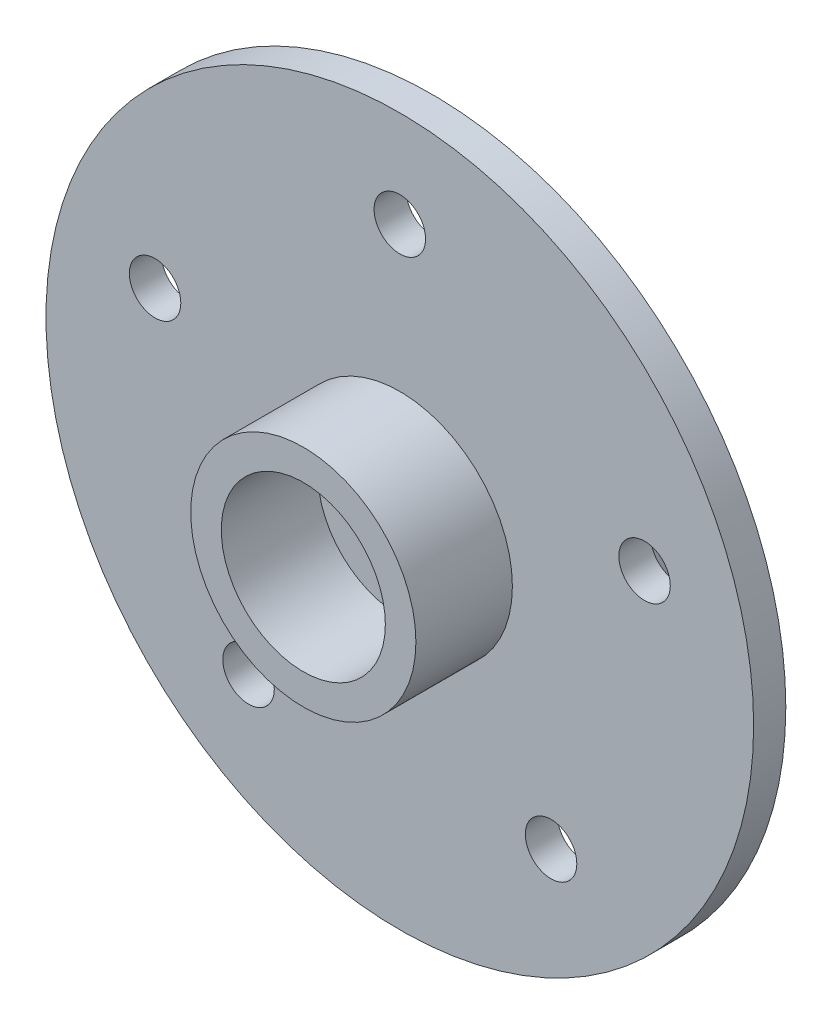
ISO-10303-21;
HEADER;
FILE_DESCRIPTION(('STEP AP214'),'2;1');
FILE_NAME('part.step','',(''),(''),'','','');
FILE_SCHEMA(('AUTOMOTIVE_DESIGN { 1 0 10303 214 1 1 1 1 }'));
ENDSEC;
DATA;
#1=APPLICATION_CONTEXT('core data for automotive mechanical design processes');
#2=APPLICATION_PROTOCOL_DEFINITION('international standard','automotive_design',2000,#1);
#3=PRODUCT_CONTEXT('',#1,'mechanical');
#4=PRODUCT('Part','Part','',(#3));
#5=PRODUCT_RELATED_PRODUCT_CATEGORY('part','',(#4));
#6=PRODUCT_DEFINITION_FORMATION('','',#4);
#7=PRODUCT_DEFINITION_CONTEXT('part definition',#1,'design');
#8=PRODUCT_DEFINITION('design','',#6,#7);
#9=PRODUCT_DEFINITION_SHAPE('','',#8);
#10=(LENGTH_UNIT() NAMED_UNIT(*) SI_UNIT(.MILLI.,.METRE.));
#11=(NAMED_UNIT(*) PLANE_ANGLE_UNIT() SI_UNIT($,.RADIAN.));
#12=(NAMED_UNIT(*) SI_UNIT($,.STERADIAN.) SOLID_ANGLE_UNIT());
#13=UNCERTAINTY_MEASURE_WITH_UNIT(LENGTH_MEASURE(1.E-05),#10,'distance_accuracy_value','');
#14=(GEOMETRIC_REPRESENTATION_CONTEXT(3) GLOBAL_UNCERTAINTY_ASSIGNED_CONTEXT((#13)) GLOBAL_UNIT_ASSIGNED_CONTEXT((#10,
#11,#12)) REPRESENTATION_CONTEXT('',''));
#15=CARTESIAN_POINT('',(0.,0.,0.));
#16=DIRECTION('',(0.,0.,1.));
#17=DIRECTION('',(1.,0.,0.));
#18=AXIS2_PLACEMENT_3D('',#15,#16,#17);
#19=CARTESIAN_POINT('',(0.,0.,2.));
#20=DIRECTION('',(0.,0.,1.));
#21=DIRECTION('',(1.,0.,0.));
#22=AXIS2_PLACEMENT_3D('',#19,#20,#21);
#23=PLANE('',#22);
#24=CARTESIAN_POINT('',(0.,0.,2.));
#25=DIRECTION('',(0.,0.,1.));
#26=DIRECTION('',(1.,0.,0.));
#27=AXIS2_PLACEMENT_3D('',#24,#25,#26);
#28=CIRCLE('',#27,3.1);
#29=CARTESIAN_POINT('',(3.1,0.,2.));
#30=VERTEX_POINT('',#29);
#31=EDGE_CURVE('E63',#30,#30,#28,.T.);
#32=ORIENTED_EDGE('',*,*,#31,.F.);
#33=EDGE_LOOP('',(#32));
#34=FACE_BOUND('',#33,.T.);
#35=CARTESIAN_POINT('',(0.,0.,2.));
#36=DIRECTION('',(0.,0.,1.));
#37=DIRECTION('',(1.,0.,0.));
#38=AXIS2_PLACEMENT_3D('',#35,#36,#37);
#39=CIRCLE('',#38,5.1);
#40=CARTESIAN_POINT('',(5.1,0.,2.));
#41=VERTEX_POINT('',#40);
#42=EDGE_CURVE('E10',#41,#41,#39,.F.);
#43=ORIENTED_EDGE('',*,*,#42,.F.);
#44=EDGE_LOOP('',(#43));
#45=FACE_BOUND('',#44,.T.);
#46=ADVANCED_FACE('F33',(#34,#45),#23,.T.);
#47=CARTESIAN_POINT('',(0.,0.,0.));
#48=DIRECTION('',(0.,0.,1.));
#49=DIRECTION('',(1.,0.,0.));
#50=AXIS2_PLACEMENT_3D('',#47,#48,#49);
#51=PLANE('',#50);
#52=CARTESIAN_POINT('',(0.,0.,0.));
#53=DIRECTION('',(0.,0.,1.));
#54=DIRECTION('',(1.,0.,0.));
#55=AXIS2_PLACEMENT_3D('',#52,#53,#54);
#56=CIRCLE('',#55,3.1);
#57=CARTESIAN_POINT('',(3.1,0.,0.));
#58=VERTEX_POINT('',#57);
#59=EDGE_CURVE('E66',#58,#58,#56,.T.);
#60=ORIENTED_EDGE('',*,*,#59,.T.);
#61=EDGE_LOOP('',(#60));
#62=FACE_BOUND('',#61,.T.);
#63=CARTESIAN_POINT('',(0.,0.,0.));
#64=DIRECTION('',(0.,0.,-1.));
#65=DIRECTION('',(-1.,0.,0.));
#66=AXIS2_PLACEMENT_3D('',#63,#64,#65);
#67=CIRCLE('',#66,7.6);
#68=CARTESIAN_POINT('',(-7.6,0.,0.));
#69=VERTEX_POINT('',#68);
#70=EDGE_CURVE('E93',#69,#69,#67,.T.);
#71=ORIENTED_EDGE('',*,*,#70,.T.);
#72=EDGE_LOOP('',(#71));
#73=FACE_BOUND('',#72,.T.);
#74=ADVANCED_FACE('F127',(#62,#73),#51,.F.);
#75=CARTESIAN_POINT('',(0.,0.,2.));
#76=DIRECTION('',(0.,0.,1.));
#77=DIRECTION('',(1.,0.,0.));
#78=AXIS2_PLACEMENT_3D('',#75,#76,#77);
#79=CIRCLE('',#78,7.);
#80=CARTESIAN_POINT('',(7.,0.,2.));
#81=VERTEX_POINT('',#80);
#82=EDGE_CURVE('E99',#81,#81,#79,.T.);
#83=ORIENTED_EDGE('',*,*,#82,.F.);
#84=EDGE_LOOP('',(#83));
#85=FACE_BOUND('',#84,.T.);
#86=CARTESIAN_POINT('',(-9.40456403667834,-12.9442719099996,2.));
#87=DIRECTION('',(0.,0.,1.));
#88=DIRECTION('',(1.,0.,0.));
#89=AXIS2_PLACEMENT_3D('',#86,#87,#88);
#90=CIRCLE('',#89,1.6);
#91=CARTESIAN_POINT('',(-7.80456403667834,-12.9442719099996,2.));
#92=VERTEX_POINT('',#91);
#93=EDGE_CURVE('E75',#92,#92,#90,.T.);
#94=ORIENTED_EDGE('',*,*,#93,.F.);
#95=EDGE_LOOP('',(#94));
#96=FACE_BOUND('',#95,.T.);
#97=CARTESIAN_POINT('',(0.,16.,2.));
#98=DIRECTION('',(0.,0.,1.));
#99=DIRECTION('',(1.,0.,0.));
#100=AXIS2_PLACEMENT_3D('',#97,#98,#99);
#101=CIRCLE('',#100,1.6);
#102=CARTESIAN_POINT('',(1.6,16.,2.));
#103=VERTEX_POINT('',#102);
#104=EDGE_CURVE('E52',#103,#103,#101,.T.);
#105=ORIENTED_EDGE('',*,*,#104,.F.);
#106=EDGE_LOOP('',(#105));
#107=FACE_BOUND('',#106,.T.);
#108=CARTESIAN_POINT('',(0.,0.,2.));
#109=DIRECTION('',(0.,0.,1.));
#110=DIRECTION('',(1.,0.,0.));
#111=AXIS2_PLACEMENT_3D('',#108,#109,#110);
#112=CIRCLE('',#111,22.);
#113=CARTESIAN_POINT('',(22.,0.,2.));
#114=VERTEX_POINT('',#113);
#115=EDGE_CURVE('E44',#114,#114,#112,.T.);
#116=ORIENTED_EDGE('',*,*,#115,.T.);
#117=EDGE_LOOP('',(#116));
#118=FACE_BOUND('',#117,.T.);
#119=CARTESIAN_POINT('',(15.2169042607229,4.94427190999981,2.));
#120=DIRECTION('',(0.,0.,1.));
#121=DIRECTION('',(1.,0.,0.));
#122=AXIS2_PLACEMENT_3D('',#119,#120,#121);
#123=CIRCLE('',#122,1.6);
#124=CARTESIAN_POINT('',(16.8169042607229,4.94427190999981,2.));
#125=VERTEX_POINT('',#124);
#126=EDGE_CURVE('E57',#125,#125,#123,.T.);
#127=ORIENTED_EDGE('',*,*,#126,.F.);
#128=EDGE_LOOP('',(#127));
#129=FACE_BOUND('',#128,.T.);
#130=CARTESIAN_POINT('',(9.4045640366808,-12.9442719099988,2.));
#131=DIRECTION('',(0.,0.,1.));
#132=DIRECTION('',(1.,0.,0.));
#133=AXIS2_PLACEMENT_3D('',#130,#131,#132);
#134=CIRCLE('',#133,1.6);
#135=CARTESIAN_POINT('',(11.0045640366808,-12.9442719099988,2.));
#136=VERTEX_POINT('',#135);
#137=EDGE_CURVE('E69',#136,#136,#134,.T.);
#138=ORIENTED_EDGE('',*,*,#137,.F.);
#139=EDGE_LOOP('',(#138));
#140=FACE_BOUND('',#139,.T.);
#141=CARTESIAN_POINT('',(-15.216904260722,4.94427190999851,2.));
#142=DIRECTION('',(0.,0.,1.));
#143=DIRECTION('',(1.,0.,0.));
#144=AXIS2_PLACEMENT_3D('',#141,#142,#143);
#145=CIRCLE('',#144,1.6);
#146=CARTESIAN_POINT('',(-13.616904260722,4.94427190999851,2.));
#147=VERTEX_POINT('',#146);
#148=EDGE_CURVE('E81',#147,#147,#145,.T.);
#149=ORIENTED_EDGE('',*,*,#148,.F.);
#150=EDGE_LOOP('',(#149));
#151=FACE_BOUND('',#150,.T.);
#152=ADVANCED_FACE('F130',(#85,#96,#107,#118,#129,#140,#151),#23,.T.);
#153=CARTESIAN_POINT('',(0.,0.,0.));
#154=DIRECTION('',(0.,0.,1.));
#155=DIRECTION('',(1.,0.,0.));
#156=AXIS2_PLACEMENT_3D('',#153,#154,#155);
#157=CIRCLE('',#156,11.);
#158=CARTESIAN_POINT('',(11.,0.,0.));
#159=VERTEX_POINT('',#158);
#160=EDGE_CURVE('E40',#159,#159,#157,.F.);
#161=ORIENTED_EDGE('',*,*,#160,.F.);
#162=EDGE_LOOP('',(#161));
#163=FACE_BOUND('',#162,.T.);
#164=CARTESIAN_POINT('',(0.,0.,0.));
#165=DIRECTION('',(0.,0.,1.));
#166=DIRECTION('',(1.,0.,0.));
#167=AXIS2_PLACEMENT_3D('',#164,#165,#166);
#168=CIRCLE('',#167,22.);
#169=CARTESIAN_POINT('',(22.,0.,0.));
#170=VERTEX_POINT('',#169);
#171=EDGE_CURVE('E48',#170,#170,#168,.T.);
#172=ORIENTED_EDGE('',*,*,#171,.F.);
#173=EDGE_LOOP('',(#172));
#174=FACE_BOUND('',#173,.T.);
#175=CARTESIAN_POINT('',(0.,16.,0.));
#176=DIRECTION('',(0.,0.,1.));
#177=DIRECTION('',(1.,0.,0.));
#178=AXIS2_PLACEMENT_3D('',#175,#176,#177);
#179=CIRCLE('',#178,1.6);
#180=CARTESIAN_POINT('',(1.6,16.,0.));
#181=VERTEX_POINT('',#180);
#182=EDGE_CURVE('E54',#181,#181,#179,.T.);
#183=ORIENTED_EDGE('',*,*,#182,.T.);
#184=EDGE_LOOP('',(#183));
#185=FACE_BOUND('',#184,.T.);
#186=CARTESIAN_POINT('',(15.2169042607229,4.94427190999981,0.));
#187=DIRECTION('',(0.,0.,1.));
#188=DIRECTION('',(1.,0.,0.));
#189=AXIS2_PLACEMENT_3D('',#186,#187,#188);
#190=CIRCLE('',#189,1.6);
#191=CARTESIAN_POINT('',(16.8169042607229,4.94427190999981,0.));
#192=VERTEX_POINT('',#191);
#193=EDGE_CURVE('E60',#192,#192,#190,.T.);
#194=ORIENTED_EDGE('',*,*,#193,.T.);
#195=EDGE_LOOP('',(#194));
#196=FACE_BOUND('',#195,.T.);
#197=CARTESIAN_POINT('',(9.4045640366808,-12.9442719099988,0.));
#198=DIRECTION('',(0.,0.,1.));
#199=DIRECTION('',(1.,0.,0.));
#200=AXIS2_PLACEMENT_3D('',#197,#198,#199);
#201=CIRCLE('',#200,1.6);
#202=CARTESIAN_POINT('',(11.0045640366808,-12.9442719099988,0.));
#203=VERTEX_POINT('',#202);
#204=EDGE_CURVE('E72',#203,#203,#201,.T.);
#205=ORIENTED_EDGE('',*,*,#204,.T.);
#206=EDGE_LOOP('',(#205));
#207=FACE_BOUND('',#206,.T.);
#208=CARTESIAN_POINT('',(-9.40456403667834,-12.9442719099996,0.));
#209=DIRECTION('',(0.,0.,1.));
#210=DIRECTION('',(1.,0.,0.));
#211=AXIS2_PLACEMENT_3D('',#208,#209,#210);
#212=CIRCLE('',#211,1.6);
#213=CARTESIAN_POINT('',(-7.80456403667834,-12.9442719099996,0.));
#214=VERTEX_POINT('',#213);
#215=EDGE_CURVE('E78',#214,#214,#212,.T.);
#216=ORIENTED_EDGE('',*,*,#215,.T.);
#217=EDGE_LOOP('',(#216));
#218=FACE_BOUND('',#217,.T.);
#219=CARTESIAN_POINT('',(-15.216904260722,4.94427190999851,0.));
#220=DIRECTION('',(0.,0.,1.));
#221=DIRECTION('',(1.,0.,0.));
#222=AXIS2_PLACEMENT_3D('',#219,#220,#221);
#223=CIRCLE('',#222,1.6);
#224=CARTESIAN_POINT('',(-13.616904260722,4.94427190999851,0.));
#225=VERTEX_POINT('',#224);
#226=EDGE_CURVE('E84',#225,#225,#223,.T.);
#227=ORIENTED_EDGE('',*,*,#226,.T.);
#228=EDGE_LOOP('',(#227));
#229=FACE_BOUND('',#228,.T.);
#230=ADVANCED_FACE('F135',(#163,#174,#185,#196,#207,#218,#229),#51,.F.);
#231=CARTESIAN_POINT('',(0.,0.,2.));
#232=DIRECTION('',(0.,0.,-1.));
#233=DIRECTION('',(-1.,0.,0.));
#234=AXIS2_PLACEMENT_3D('',#231,#232,#233);
#235=CYLINDRICAL_SURFACE('',#234,22.);
#236=ORIENTED_EDGE('',*,*,#115,.F.);
#237=EDGE_LOOP('',(#236));
#238=FACE_BOUND('',#237,.T.);
#239=ORIENTED_EDGE('',*,*,#171,.T.);
#240=EDGE_LOOP('',(#239));
#241=FACE_BOUND('',#240,.T.);
#242=ADVANCED_FACE('F35',(#238,#241),#235,.T.);
#243=CARTESIAN_POINT('',(0.,16.,2.));
#244=DIRECTION('',(0.,0.,-1.));
#245=DIRECTION('',(-1.,0.,0.));
#246=AXIS2_PLACEMENT_3D('',#243,#244,#245);
#247=CYLINDRICAL_SURFACE('',#246,1.6);
#248=ORIENTED_EDGE('',*,*,#104,.T.);
#249=EDGE_LOOP('',(#248));
#250=FACE_BOUND('',#249,.T.);
#251=ORIENTED_EDGE('',*,*,#182,.F.);
#252=EDGE_LOOP('',(#251));
#253=FACE_BOUND('',#252,.T.);
#254=ADVANCED_FACE('F187',(#250,#253),#247,.F.);
#255=CARTESIAN_POINT('',(15.2169042607229,4.94427190999981,2.));
#256=DIRECTION('',(0.,0.,-1.));
#257=DIRECTION('',(-1.,0.,0.));
#258=AXIS2_PLACEMENT_3D('',#255,#256,#257);
#259=CYLINDRICAL_SURFACE('',#258,1.6);
#260=ORIENTED_EDGE('',*,*,#126,.T.);
#261=EDGE_LOOP('',(#260));
#262=FACE_BOUND('',#261,.T.);
#263=ORIENTED_EDGE('',*,*,#193,.F.);
#264=EDGE_LOOP('',(#263));
#265=FACE_BOUND('',#264,.T.);
#266=ADVANCED_FACE('F184',(#262,#265),#259,.F.);
#267=CARTESIAN_POINT('',(0.,0.,2.));
#268=DIRECTION('',(0.,0.,-1.));
#269=DIRECTION('',(-1.,0.,0.));
#270=AXIS2_PLACEMENT_3D('',#267,#268,#269);
#271=CYLINDRICAL_SURFACE('',#270,3.1);
#272=ORIENTED_EDGE('',*,*,#31,.T.);
#273=EDGE_LOOP('',(#272));
#274=FACE_BOUND('',#273,.T.);
#275=ORIENTED_EDGE('',*,*,#59,.F.);
#276=EDGE_LOOP('',(#275));
#277=FACE_BOUND('',#276,.T.);
#278=ADVANCED_FACE('F180',(#274,#277),#271,.F.);
#279=CARTESIAN_POINT('',(9.4045640366808,-12.9442719099988,2.));
#280=DIRECTION('',(0.,0.,-1.));
#281=DIRECTION('',(-1.,0.,0.));
#282=AXIS2_PLACEMENT_3D('',#279,#280,#281);
#283=CYLINDRICAL_SURFACE('',#282,1.6);
#284=ORIENTED_EDGE('',*,*,#137,.T.);
#285=EDGE_LOOP('',(#284));
#286=FACE_BOUND('',#285,.T.);
#287=ORIENTED_EDGE('',*,*,#204,.F.);
#288=EDGE_LOOP('',(#287));
#289=FACE_BOUND('',#288,.T.);
#290=ADVANCED_FACE('F173',(#286,#289),#283,.F.);
#291=CARTESIAN_POINT('',(-9.40456403667834,-12.9442719099996,2.));
#292=DIRECTION('',(0.,0.,-1.));
#293=DIRECTION('',(-1.,0.,0.));
#294=AXIS2_PLACEMENT_3D('',#291,#292,#293);
#295=CYLINDRICAL_SURFACE('',#294,1.6);
#296=ORIENTED_EDGE('',*,*,#93,.T.);
#297=EDGE_LOOP('',(#296));
#298=FACE_BOUND('',#297,.T.);
#299=ORIENTED_EDGE('',*,*,#215,.F.);
#300=EDGE_LOOP('',(#299));
#301=FACE_BOUND('',#300,.T.);
#302=ADVANCED_FACE('F163',(#298,#301),#295,.F.);
#303=CARTESIAN_POINT('',(-15.216904260722,4.94427190999851,2.));
#304=DIRECTION('',(0.,0.,-1.));
#305=DIRECTION('',(-1.,0.,0.));
#306=AXIS2_PLACEMENT_3D('',#303,#304,#305);
#307=CYLINDRICAL_SURFACE('',#306,1.6);
#308=ORIENTED_EDGE('',*,*,#148,.T.);
#309=EDGE_LOOP('',(#308));
#310=FACE_BOUND('',#309,.T.);
#311=ORIENTED_EDGE('',*,*,#226,.F.);
#312=EDGE_LOOP('',(#311));
#313=FACE_BOUND('',#312,.T.);
#314=ADVANCED_FACE('F159',(#310,#313),#307,.F.);
#315=CARTESIAN_POINT('',(0.,0.,-5.));
#316=DIRECTION('',(0.,0.,-1.));
#317=DIRECTION('',(-1.,0.,0.));
#318=AXIS2_PLACEMENT_3D('',#315,#316,#317);
#319=PLANE('',#318);
#320=CARTESIAN_POINT('',(0.,0.,-5.));
#321=DIRECTION('',(0.,0.,-1.));
#322=DIRECTION('',(-1.,0.,0.));
#323=AXIS2_PLACEMENT_3D('',#320,#321,#322);
#324=CIRCLE('',#323,11.);
#325=CARTESIAN_POINT('',(-11.,0.,-5.));
#326=VERTEX_POINT('',#325);
#327=EDGE_CURVE('E87',#326,#326,#324,.T.);
#328=ORIENTED_EDGE('',*,*,#327,.T.);
#329=EDGE_LOOP('',(#328));
#330=FACE_BOUND('',#329,.T.);
#331=CARTESIAN_POINT('',(0.,0.,-5.));
#332=DIRECTION('',(0.,0.,-1.));
#333=DIRECTION('',(-1.,0.,0.));
#334=AXIS2_PLACEMENT_3D('',#331,#332,#333);
#335=CIRCLE('',#334,7.6);
#336=CARTESIAN_POINT('',(-7.6,0.,-5.));
#337=VERTEX_POINT('',#336);
#338=EDGE_CURVE('E92',#337,#337,#335,.T.);
#339=ORIENTED_EDGE('',*,*,#338,.F.);
#340=EDGE_LOOP('',(#339));
#341=FACE_BOUND('',#340,.T.);
#342=ADVANCED_FACE('F162',(#330,#341),#319,.T.);
#343=CARTESIAN_POINT('',(0.,0.,-5.));
#344=DIRECTION('',(0.,0.,1.));
#345=DIRECTION('',(1.,0.,0.));
#346=AXIS2_PLACEMENT_3D('',#343,#344,#345);
#347=CYLINDRICAL_SURFACE('',#346,11.);
#348=ORIENTED_EDGE('',*,*,#327,.F.);
#349=EDGE_LOOP('',(#348));
#350=FACE_BOUND('',#349,.T.);
#351=ORIENTED_EDGE('',*,*,#160,.T.);
#352=EDGE_LOOP('',(#351));
#353=FACE_BOUND('',#352,.T.);
#354=ADVANCED_FACE('F122',(#350,#353),#347,.T.);
#355=CARTESIAN_POINT('',(0.,0.,-5.));
#356=DIRECTION('',(0.,0.,1.));
#357=DIRECTION('',(1.,0.,0.));
#358=AXIS2_PLACEMENT_3D('',#355,#356,#357);
#359=CYLINDRICAL_SURFACE('',#358,7.6);
#360=ORIENTED_EDGE('',*,*,#338,.T.);
#361=EDGE_LOOP('',(#360));
#362=FACE_BOUND('',#361,.T.);
#363=ORIENTED_EDGE('',*,*,#70,.F.);
#364=EDGE_LOOP('',(#363));
#365=FACE_BOUND('',#364,.T.);
#366=ADVANCED_FACE('F113',(#362,#365),#359,.F.);
#367=CARTESIAN_POINT('',(0.,0.,8.));
#368=DIRECTION('',(0.,0.,1.));
#369=DIRECTION('',(1.,0.,0.));
#370=AXIS2_PLACEMENT_3D('',#367,#368,#369);
#371=PLANE('',#370);
#372=CARTESIAN_POINT('',(0.,0.,8.));
#373=DIRECTION('',(0.,0.,1.));
#374=DIRECTION('',(1.,0.,0.));
#375=AXIS2_PLACEMENT_3D('',#372,#373,#374);
#376=CIRCLE('',#375,7.);
#377=CARTESIAN_POINT('',(7.,0.,8.));
#378=VERTEX_POINT('',#377);
#379=EDGE_CURVE('E96',#378,#378,#376,.T.);
#380=ORIENTED_EDGE('',*,*,#379,.T.);
#381=EDGE_LOOP('',(#380));
#382=FACE_BOUND('',#381,.T.);
#383=CARTESIAN_POINT('',(0.,0.,8.));
#384=DIRECTION('',(0.,0.,1.));
#385=DIRECTION('',(1.,0.,0.));
#386=AXIS2_PLACEMENT_3D('',#383,#384,#385);
#387=CIRCLE('',#386,5.1);
#388=CARTESIAN_POINT('',(5.1,0.,8.));
#389=VERTEX_POINT('',#388);
#390=EDGE_CURVE('E102',#389,#389,#387,.T.);
#391=ORIENTED_EDGE('',*,*,#390,.F.);
#392=EDGE_LOOP('',(#391));
#393=FACE_BOUND('',#392,.T.);
#394=ADVANCED_FACE('F110',(#382,#393),#371,.T.);
#395=CARTESIAN_POINT('',(0.,0.,8.));
#396=DIRECTION('',(0.,0.,-1.));
#397=DIRECTION('',(-1.,0.,0.));
#398=AXIS2_PLACEMENT_3D('',#395,#396,#397);
#399=CYLINDRICAL_SURFACE('',#398,7.);
#400=ORIENTED_EDGE('',*,*,#379,.F.);
#401=EDGE_LOOP('',(#400));
#402=FACE_BOUND('',#401,.T.);
#403=ORIENTED_EDGE('',*,*,#82,.T.);
#404=EDGE_LOOP('',(#403));
#405=FACE_BOUND('',#404,.T.);
#406=ADVANCED_FACE('F112',(#402,#405),#399,.T.);
#407=CARTESIAN_POINT('',(0.,0.,8.));
#408=DIRECTION('',(0.,0.,-1.));
#409=DIRECTION('',(-1.,0.,0.));
#410=AXIS2_PLACEMENT_3D('',#407,#408,#409);
#411=CYLINDRICAL_SURFACE('',#410,5.1);
#412=ORIENTED_EDGE('',*,*,#390,.T.);
#413=EDGE_LOOP('',(#412));
#414=FACE_BOUND('',#413,.T.);
#415=ORIENTED_EDGE('',*,*,#42,.T.);
#416=EDGE_LOOP('',(#415));
#417=FACE_BOUND('',#416,.T.);
#418=ADVANCED_FACE('F108',(#414,#417),#411,.F.);
#419=CLOSED_SHELL('',(#46,#74,#152,#230,#242,#254,#266,#278,#290,#302,#314,#342,#354,#366,#394,
#406,#418));
#420=MANIFOLD_SOLID_BREP('B2',#419);
#421=ADVANCED_BREP_SHAPE_REPRESENTATION('',(#18,#420),#14);
#422=SHAPE_DEFINITION_REPRESENTATION(#9,#421);
ENDSEC;
END-ISO-10303-21;
